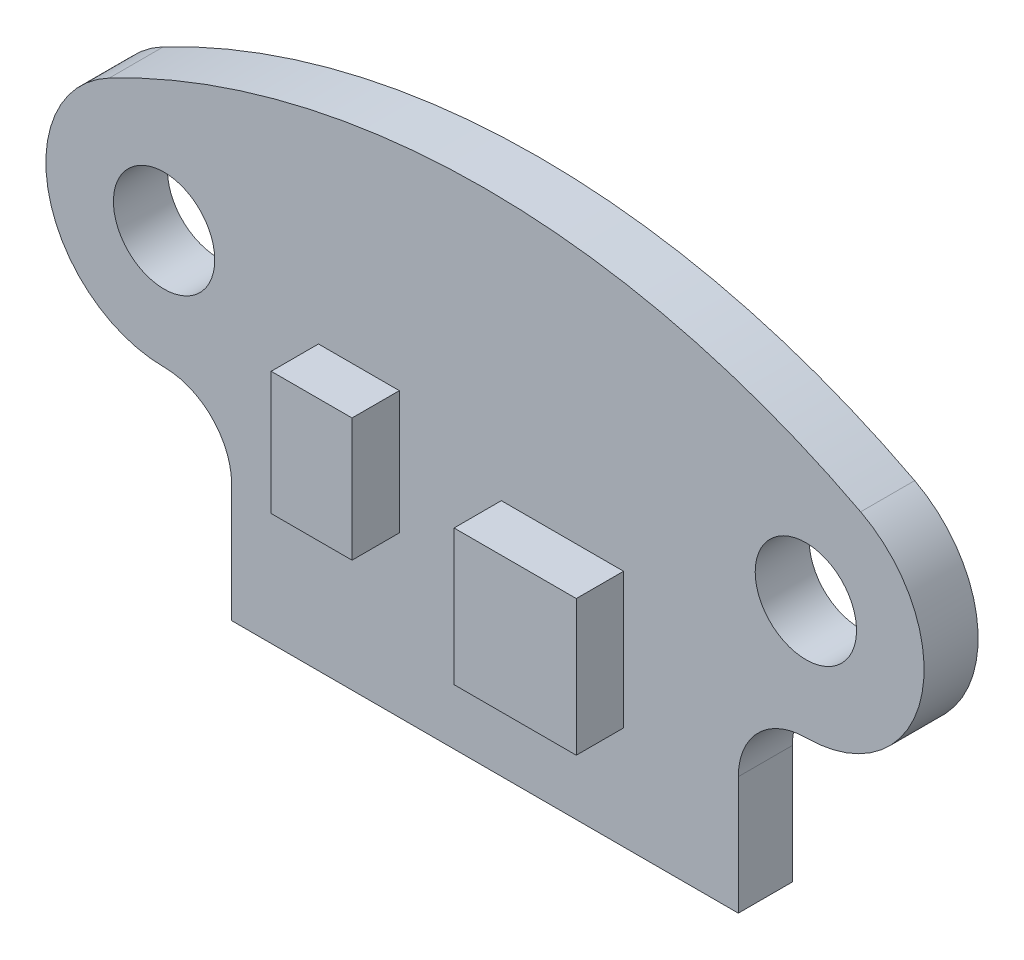
ISO-10303-21;
HEADER;
FILE_DESCRIPTION(('STEP AP214'),'2;1');
FILE_NAME('part.step','',(''),(''),'','','');
FILE_SCHEMA(('AUTOMOTIVE_DESIGN { 1 0 10303 214 1 1 1 1 }'));
ENDSEC;
DATA;
#1=APPLICATION_CONTEXT('core data for automotive mechanical design processes');
#2=APPLICATION_PROTOCOL_DEFINITION('international standard','automotive_design',2000,#1);
#3=PRODUCT_CONTEXT('',#1,'mechanical');
#4=PRODUCT('Part','Part','',(#3));
#5=PRODUCT_RELATED_PRODUCT_CATEGORY('part','',(#4));
#6=PRODUCT_DEFINITION_FORMATION('','',#4);
#7=PRODUCT_DEFINITION_CONTEXT('part definition',#1,'design');
#8=PRODUCT_DEFINITION('design','',#6,#7);
#9=PRODUCT_DEFINITION_SHAPE('','',#8);
#10=(LENGTH_UNIT() NAMED_UNIT(*) SI_UNIT(.MILLI.,.METRE.));
#11=(NAMED_UNIT(*) PLANE_ANGLE_UNIT() SI_UNIT($,.RADIAN.));
#12=(NAMED_UNIT(*) SI_UNIT($,.STERADIAN.) SOLID_ANGLE_UNIT());
#13=UNCERTAINTY_MEASURE_WITH_UNIT(LENGTH_MEASURE(1.E-05),#10,'distance_accuracy_value','');
#14=(GEOMETRIC_REPRESENTATION_CONTEXT(3) GLOBAL_UNCERTAINTY_ASSIGNED_CONTEXT((#13)) GLOBAL_UNIT_ASSIGNED_CONTEXT((#10,
#11,#12)) REPRESENTATION_CONTEXT('',''));
#15=CARTESIAN_POINT('',(0.,0.,0.));
#16=DIRECTION('',(0.,0.,1.));
#17=DIRECTION('',(1.,0.,0.));
#18=AXIS2_PLACEMENT_3D('',#15,#16,#17);
#19=CARTESIAN_POINT('',(17.,9.,-9.89949493661167));
#20=DIRECTION('',(0.,0.,1.));
#21=DIRECTION('',(1.,0.,0.));
#22=AXIS2_PLACEMENT_3D('',#19,#20,#21);
#23=CYLINDRICAL_SURFACE('',#22,3.5);
#24=CARTESIAN_POINT('',(17.,9.,0.));
#25=DIRECTION('',(0.,0.,-1.));
#26=DIRECTION('',(-1.,0.,0.));
#27=AXIS2_PLACEMENT_3D('',#24,#25,#26);
#28=CIRCLE('',#27,3.5);
#29=CARTESIAN_POINT('',(17.,5.5,0.));
#30=VERTEX_POINT('',#29);
#31=CARTESIAN_POINT('',(18.6219512195122,12.1014954846852,0.));
#32=VERTEX_POINT('',#31);
#33=EDGE_CURVE('E243',#30,#32,#28,.F.);
#34=ORIENTED_EDGE('',*,*,#33,.T.);
#35=DIRECTION('',(0.,0.,1.));
#36=VECTOR('',#35,1.);
#37=CARTESIAN_POINT('',(18.6219512195122,12.1014954846852,-22.8439032240007));
#38=LINE('',#37,#36);
#39=CARTESIAN_POINT('',(18.6219512195122,12.1014954846852,1.6));
#40=VERTEX_POINT('',#39);
#41=EDGE_CURVE('E164',#32,#40,#38,.T.);
#42=ORIENTED_EDGE('',*,*,#41,.T.);
#43=CARTESIAN_POINT('',(17.,9.,1.6));
#44=DIRECTION('',(0.,0.,1.));
#45=DIRECTION('',(-1.,0.,0.));
#46=AXIS2_PLACEMENT_3D('',#43,#44,#45);
#47=CIRCLE('',#46,3.5);
#48=CARTESIAN_POINT('',(17.,5.5,1.6));
#49=VERTEX_POINT('',#48);
#50=EDGE_CURVE('E163',#49,#40,#47,.T.);
#51=ORIENTED_EDGE('',*,*,#50,.F.);
#52=DIRECTION('',(0.,0.,1.));
#53=VECTOR('',#52,1.);
#54=CARTESIAN_POINT('',(17.,5.5,-9.89949493661167));
#55=LINE('',#54,#53);
#56=EDGE_CURVE('E206',#49,#30,#55,.F.);
#57=ORIENTED_EDGE('',*,*,#56,.T.);
#58=EDGE_LOOP('',(#34,#42,#51,#57));
#59=FACE_BOUND('',#58,.T.);
#60=ADVANCED_FACE('F37',(#59),#23,.T.);
#61=CARTESIAN_POINT('',(0.,0.,1.6));
#62=DIRECTION('',(0.,0.,-1.));
#63=DIRECTION('',(-1.,0.,0.));
#64=AXIS2_PLACEMENT_3D('',#61,#62,#63);
#65=PLANE('',#64);
#66=CARTESIAN_POINT('',(7.5,-9.16590212458495,1.6));
#67=DIRECTION('',(0.,0.,1.));
#68=DIRECTION('',(-1.,0.,0.));
#69=AXIS2_PLACEMENT_3D('',#66,#67,#68);
#70=CIRCLE('',#69,24.);
#71=CARTESIAN_POINT('',(-3.62195121951219,12.1014954846852,1.6));
#72=VERTEX_POINT('',#71);
#73=EDGE_CURVE('E52',#40,#72,#70,.T.);
#74=ORIENTED_EDGE('',*,*,#73,.T.);
#75=CARTESIAN_POINT('',(-2.,9.,1.6));
#76=DIRECTION('',(0.,0.,1.));
#77=DIRECTION('',(1.,0.,0.));
#78=AXIS2_PLACEMENT_3D('',#75,#76,#77);
#79=CIRCLE('',#78,3.5);
#80=CARTESIAN_POINT('',(-2.,5.5,1.6));
#81=VERTEX_POINT('',#80);
#82=EDGE_CURVE('E160',#72,#81,#79,.T.);
#83=ORIENTED_EDGE('',*,*,#82,.T.);
#84=CARTESIAN_POINT('',(-2.,3.5,1.6));
#85=DIRECTION('',(0.,0.,-1.));
#86=DIRECTION('',(-1.,0.,0.));
#87=AXIS2_PLACEMENT_3D('',#84,#85,#86);
#88=CIRCLE('',#87,2.);
#89=CARTESIAN_POINT('',(0.,3.5,1.6));
#90=VERTEX_POINT('',#89);
#91=EDGE_CURVE('E12',#81,#90,#88,.T.);
#92=ORIENTED_EDGE('',*,*,#91,.T.);
#93=DIRECTION('',(0.,-1.,0.));
#94=VECTOR('',#93,1.);
#95=CARTESIAN_POINT('',(0.,0.,1.6));
#96=LINE('',#95,#94);
#97=CARTESIAN_POINT('',(0.,0.,1.6));
#98=VERTEX_POINT('',#97);
#99=EDGE_CURVE('E184',#90,#98,#96,.T.);
#100=ORIENTED_EDGE('',*,*,#99,.T.);
#101=DIRECTION('',(1.,0.,0.));
#102=VECTOR('',#101,1.);
#103=CARTESIAN_POINT('',(0.,0.,1.6));
#104=LINE('',#103,#102);
#105=CARTESIAN_POINT('',(15.,0.,1.6));
#106=VERTEX_POINT('',#105);
#107=EDGE_CURVE('E186',#98,#106,#104,.T.);
#108=ORIENTED_EDGE('',*,*,#107,.T.);
#109=DIRECTION('',(0.,1.,0.));
#110=VECTOR('',#109,1.);
#111=CARTESIAN_POINT('',(15.,0.,1.6));
#112=LINE('',#111,#110);
#113=CARTESIAN_POINT('',(15.,3.5,1.6));
#114=VERTEX_POINT('',#113);
#115=EDGE_CURVE('E189',#106,#114,#112,.T.);
#116=ORIENTED_EDGE('',*,*,#115,.T.);
#117=CARTESIAN_POINT('',(17.,3.5,1.6));
#118=DIRECTION('',(0.,0.,-1.));
#119=DIRECTION('',(-1.,0.,0.));
#120=AXIS2_PLACEMENT_3D('',#117,#118,#119);
#121=CIRCLE('',#120,2.);
#122=EDGE_CURVE('E212',#114,#49,#121,.T.);
#123=ORIENTED_EDGE('',*,*,#122,.T.);
#124=ORIENTED_EDGE('',*,*,#50,.T.);
#125=EDGE_LOOP('',(#74,#83,#92,#100,#108,#116,#123,#124));
#126=FACE_BOUND('',#125,.T.);
#127=DIRECTION('',(-1.,0.,0.));
#128=VECTOR('',#127,1.);
#129=CARTESIAN_POINT('',(7.98437403809305,7.06847214285232,1.6));
#130=LINE('',#129,#128);
#131=CARTESIAN_POINT('',(11.6029330285529,7.06847214285232,1.6));
#132=VERTEX_POINT('',#131);
#133=CARTESIAN_POINT('',(7.98437403809305,7.06847214285232,1.6));
#134=VERTEX_POINT('',#133);
#135=EDGE_CURVE('E269',#132,#134,#130,.T.);
#136=ORIENTED_EDGE('',*,*,#135,.F.);
#137=DIRECTION('',(0.,1.,0.));
#138=VECTOR('',#137,1.);
#139=CARTESIAN_POINT('',(11.6029330285529,7.06847214285232,1.6));
#140=LINE('',#139,#138);
#141=CARTESIAN_POINT('',(11.6029330285529,3.05101688572764,1.6));
#142=VERTEX_POINT('',#141);
#143=EDGE_CURVE('E272',#142,#132,#140,.T.);
#144=ORIENTED_EDGE('',*,*,#143,.F.);
#145=DIRECTION('',(1.,0.,0.));
#146=VECTOR('',#145,1.);
#147=CARTESIAN_POINT('',(7.98437403809305,3.05101688572764,1.6));
#148=LINE('',#147,#146);
#149=CARTESIAN_POINT('',(7.98437403809305,3.05101688572764,1.6));
#150=VERTEX_POINT('',#149);
#151=EDGE_CURVE('E275',#150,#142,#148,.T.);
#152=ORIENTED_EDGE('',*,*,#151,.F.);
#153=DIRECTION('',(0.,-1.,0.));
#154=VECTOR('',#153,1.);
#155=CARTESIAN_POINT('',(7.98437403809305,7.06847214285232,1.6));
#156=LINE('',#155,#154);
#157=EDGE_CURVE('E278',#134,#150,#156,.T.);
#158=ORIENTED_EDGE('',*,*,#157,.F.);
#159=EDGE_LOOP('',(#136,#144,#152,#158));
#160=FACE_BOUND('',#159,.T.);
#161=CARTESIAN_POINT('',(-2.,9.,1.6));
#162=DIRECTION('',(0.,0.,1.));
#163=DIRECTION('',(1.,0.,0.));
#164=AXIS2_PLACEMENT_3D('',#161,#162,#163);
#165=CIRCLE('',#164,1.5);
#166=CARTESIAN_POINT('',(-0.499999999999999,9.,1.6));
#167=VERTEX_POINT('',#166);
#168=EDGE_CURVE('E171',#167,#167,#165,.T.);
#169=ORIENTED_EDGE('',*,*,#168,.F.);
#170=EDGE_LOOP('',(#169));
#171=FACE_BOUND('',#170,.T.);
#172=CARTESIAN_POINT('',(17.,9.,1.6));
#173=DIRECTION('',(0.,0.,1.));
#174=DIRECTION('',(-1.,0.,0.));
#175=AXIS2_PLACEMENT_3D('',#172,#173,#174);
#176=CIRCLE('',#175,1.5);
#177=CARTESIAN_POINT('',(15.5,9.,1.6));
#178=VERTEX_POINT('',#177);
#179=EDGE_CURVE('E244',#178,#178,#176,.T.);
#180=ORIENTED_EDGE('',*,*,#179,.F.);
#181=EDGE_LOOP('',(#180));
#182=FACE_BOUND('',#181,.T.);
#183=DIRECTION('',(-1.,0.,0.));
#184=VECTOR('',#183,1.);
#185=CARTESIAN_POINT('',(2.57078184764135,8.37913130475115,1.6));
#186=LINE('',#185,#184);
#187=CARTESIAN_POINT('',(4.96415944763052,8.37913130475115,1.6));
#188=VERTEX_POINT('',#187);
#189=CARTESIAN_POINT('',(2.57078184764135,8.37913130475115,1.6));
#190=VERTEX_POINT('',#189);
#191=EDGE_CURVE('E60',#188,#190,#186,.T.);
#192=ORIENTED_EDGE('',*,*,#191,.F.);
#193=DIRECTION('',(0.,1.,0.));
#194=VECTOR('',#193,1.);
#195=CARTESIAN_POINT('',(4.96415944763052,8.37913130475115,1.6));
#196=LINE('',#195,#194);
#197=CARTESIAN_POINT('',(4.96415944763052,4.73207972381527,1.6));
#198=VERTEX_POINT('',#197);
#199=EDGE_CURVE('E302',#198,#188,#196,.T.);
#200=ORIENTED_EDGE('',*,*,#199,.F.);
#201=DIRECTION('',(1.,0.,0.));
#202=VECTOR('',#201,1.);
#203=CARTESIAN_POINT('',(2.57078184764135,4.73207972381527,1.6));
#204=LINE('',#203,#202);
#205=CARTESIAN_POINT('',(2.57078184764135,4.73207972381527,1.6));
#206=VERTEX_POINT('',#205);
#207=EDGE_CURVE('E305',#206,#198,#204,.T.);
#208=ORIENTED_EDGE('',*,*,#207,.F.);
#209=DIRECTION('',(0.,-1.,0.));
#210=VECTOR('',#209,1.);
#211=CARTESIAN_POINT('',(2.57078184764135,8.37913130475115,1.6));
#212=LINE('',#211,#210);
#213=EDGE_CURVE('E154',#190,#206,#212,.T.);
#214=ORIENTED_EDGE('',*,*,#213,.F.);
#215=EDGE_LOOP('',(#192,#200,#208,#214));
#216=FACE_BOUND('',#215,.T.);
#217=ADVANCED_FACE('F158',(#126,#160,#171,#182,#216),#65,.F.);
#218=CARTESIAN_POINT('',(15.,0.,1.6));
#219=DIRECTION('',(-1.,0.,0.));
#220=DIRECTION('',(0.,0.,1.));
#221=AXIS2_PLACEMENT_3D('',#218,#219,#220);
#222=PLANE('',#221);
#223=DIRECTION('',(0.,1.,0.));
#224=VECTOR('',#223,1.);
#225=CARTESIAN_POINT('',(15.,0.,0.));
#226=LINE('',#225,#224);
#227=CARTESIAN_POINT('',(15.,0.,0.));
#228=VERTEX_POINT('',#227);
#229=CARTESIAN_POINT('',(15.,3.5,0.));
#230=VERTEX_POINT('',#229);
#231=EDGE_CURVE('E187',#228,#230,#226,.T.);
#232=ORIENTED_EDGE('',*,*,#231,.T.);
#233=DIRECTION('',(0.,0.,1.));
#234=VECTOR('',#233,1.);
#235=CARTESIAN_POINT('',(15.,3.5,1.6));
#236=LINE('',#235,#234);
#237=EDGE_CURVE('E203',#230,#114,#236,.T.);
#238=ORIENTED_EDGE('',*,*,#237,.T.);
#239=ORIENTED_EDGE('',*,*,#115,.F.);
#240=DIRECTION('',(0.,0.,-1.));
#241=VECTOR('',#240,1.);
#242=CARTESIAN_POINT('',(15.,0.,1.6));
#243=LINE('',#242,#241);
#244=EDGE_CURVE('E192',#106,#228,#243,.T.);
#245=ORIENTED_EDGE('',*,*,#244,.T.);
#246=EDGE_LOOP('',(#232,#238,#239,#245));
#247=FACE_BOUND('',#246,.T.);
#248=ADVANCED_FACE('F233',(#247),#222,.F.);
#249=CARTESIAN_POINT('',(0.,0.,1.6));
#250=DIRECTION('',(1.,0.,0.));
#251=DIRECTION('',(0.,0.,-1.));
#252=AXIS2_PLACEMENT_3D('',#249,#250,#251);
#253=PLANE('',#252);
#254=ORIENTED_EDGE('',*,*,#99,.F.);
#255=DIRECTION('',(0.,0.,1.));
#256=VECTOR('',#255,1.);
#257=CARTESIAN_POINT('',(0.,3.5,1.6));
#258=LINE('',#257,#256);
#259=CARTESIAN_POINT('',(0.,3.5,0.));
#260=VERTEX_POINT('',#259);
#261=EDGE_CURVE('E208',#90,#260,#258,.F.);
#262=ORIENTED_EDGE('',*,*,#261,.T.);
#263=DIRECTION('',(0.,-1.,0.));
#264=VECTOR('',#263,1.);
#265=CARTESIAN_POINT('',(0.,0.,0.));
#266=LINE('',#265,#264);
#267=CARTESIAN_POINT('',(0.,0.,0.));
#268=VERTEX_POINT('',#267);
#269=EDGE_CURVE('E174',#260,#268,#266,.T.);
#270=ORIENTED_EDGE('',*,*,#269,.T.);
#271=DIRECTION('',(0.,0.,-1.));
#272=VECTOR('',#271,1.);
#273=CARTESIAN_POINT('',(0.,0.,1.6));
#274=LINE('',#273,#272);
#275=EDGE_CURVE('E200',#98,#268,#274,.T.);
#276=ORIENTED_EDGE('',*,*,#275,.F.);
#277=EDGE_LOOP('',(#254,#262,#270,#276));
#278=FACE_BOUND('',#277,.T.);
#279=ADVANCED_FACE('F227',(#278),#253,.F.);
#280=CARTESIAN_POINT('',(0.,0.,1.6));
#281=DIRECTION('',(0.,1.,0.));
#282=DIRECTION('',(0.,0.,1.));
#283=AXIS2_PLACEMENT_3D('',#280,#281,#282);
#284=PLANE('',#283);
#285=DIRECTION('',(1.,0.,0.));
#286=VECTOR('',#285,1.);
#287=CARTESIAN_POINT('',(0.,0.,0.));
#288=LINE('',#287,#286);
#289=EDGE_CURVE('E194',#268,#228,#288,.T.);
#290=ORIENTED_EDGE('',*,*,#289,.T.);
#291=ORIENTED_EDGE('',*,*,#244,.F.);
#292=ORIENTED_EDGE('',*,*,#107,.F.);
#293=ORIENTED_EDGE('',*,*,#275,.T.);
#294=EDGE_LOOP('',(#290,#291,#292,#293));
#295=FACE_BOUND('',#294,.T.);
#296=ADVANCED_FACE('F229',(#295),#284,.F.);
#297=CARTESIAN_POINT('',(0.,0.,0.));
#298=DIRECTION('',(0.,0.,-1.));
#299=DIRECTION('',(-1.,0.,0.));
#300=AXIS2_PLACEMENT_3D('',#297,#298,#299);
#301=PLANE('',#300);
#302=CARTESIAN_POINT('',(-2.,9.,0.));
#303=DIRECTION('',(0.,0.,-1.));
#304=DIRECTION('',(-1.,0.,0.));
#305=AXIS2_PLACEMENT_3D('',#302,#303,#304);
#306=CIRCLE('',#305,3.5);
#307=CARTESIAN_POINT('',(-3.62195121951219,12.1014954846852,0.));
#308=VERTEX_POINT('',#307);
#309=CARTESIAN_POINT('',(-2.,5.5,0.));
#310=VERTEX_POINT('',#309);
#311=EDGE_CURVE('E177',#308,#310,#306,.F.);
#312=ORIENTED_EDGE('',*,*,#311,.F.);
#313=CARTESIAN_POINT('',(7.5,-9.16590212458495,0.));
#314=DIRECTION('',(0.,0.,-1.));
#315=DIRECTION('',(-1.,0.,0.));
#316=AXIS2_PLACEMENT_3D('',#313,#314,#315);
#317=CIRCLE('',#316,24.);
#318=EDGE_CURVE('E150',#32,#308,#317,.F.);
#319=ORIENTED_EDGE('',*,*,#318,.F.);
#320=ORIENTED_EDGE('',*,*,#33,.F.);
#321=CARTESIAN_POINT('',(17.,3.5,0.));
#322=DIRECTION('',(0.,0.,-1.));
#323=DIRECTION('',(-1.,0.,0.));
#324=AXIS2_PLACEMENT_3D('',#321,#322,#323);
#325=CIRCLE('',#324,2.);
#326=EDGE_CURVE('E214',#30,#230,#325,.F.);
#327=ORIENTED_EDGE('',*,*,#326,.T.);
#328=ORIENTED_EDGE('',*,*,#231,.F.);
#329=ORIENTED_EDGE('',*,*,#289,.F.);
#330=ORIENTED_EDGE('',*,*,#269,.F.);
#331=CARTESIAN_POINT('',(-2.,3.5,0.));
#332=DIRECTION('',(0.,0.,-1.));
#333=DIRECTION('',(-1.,0.,0.));
#334=AXIS2_PLACEMENT_3D('',#331,#332,#333);
#335=CIRCLE('',#334,2.);
#336=EDGE_CURVE('E45',#260,#310,#335,.F.);
#337=ORIENTED_EDGE('',*,*,#336,.T.);
#338=EDGE_LOOP('',(#312,#319,#320,#327,#328,#329,#330,#337));
#339=FACE_BOUND('',#338,.T.);
#340=CARTESIAN_POINT('',(-2.,9.,0.));
#341=DIRECTION('',(0.,0.,-1.));
#342=DIRECTION('',(-1.,0.,0.));
#343=AXIS2_PLACEMENT_3D('',#340,#341,#342);
#344=CIRCLE('',#343,1.5);
#345=CARTESIAN_POINT('',(-3.5,9.,0.));
#346=VERTEX_POINT('',#345);
#347=EDGE_CURVE('E170',#346,#346,#344,.F.);
#348=ORIENTED_EDGE('',*,*,#347,.T.);
#349=EDGE_LOOP('',(#348));
#350=FACE_BOUND('',#349,.T.);
#351=CARTESIAN_POINT('',(17.,9.,0.));
#352=DIRECTION('',(0.,0.,-1.));
#353=DIRECTION('',(-1.,0.,0.));
#354=AXIS2_PLACEMENT_3D('',#351,#352,#353);
#355=CIRCLE('',#354,1.5);
#356=CARTESIAN_POINT('',(15.5,9.,0.));
#357=VERTEX_POINT('',#356);
#358=EDGE_CURVE('E180',#357,#357,#355,.F.);
#359=ORIENTED_EDGE('',*,*,#358,.T.);
#360=EDGE_LOOP('',(#359));
#361=FACE_BOUND('',#360,.T.);
#362=ADVANCED_FACE('F218',(#339,#350,#361),#301,.T.);
#363=CARTESIAN_POINT('',(-2.,9.,-9.89949493661167));
#364=DIRECTION('',(0.,0.,1.));
#365=DIRECTION('',(1.,0.,0.));
#366=AXIS2_PLACEMENT_3D('',#363,#364,#365);
#367=CYLINDRICAL_SURFACE('',#366,3.5);
#368=DIRECTION('',(0.,0.,1.));
#369=VECTOR('',#368,1.);
#370=CARTESIAN_POINT('',(-3.62195121951219,12.1014954846852,-22.8439032240007));
#371=LINE('',#370,#369);
#372=EDGE_CURVE('E148',#308,#72,#371,.T.);
#373=ORIENTED_EDGE('',*,*,#372,.F.);
#374=ORIENTED_EDGE('',*,*,#311,.T.);
#375=DIRECTION('',(0.,0.,1.));
#376=VECTOR('',#375,1.);
#377=CARTESIAN_POINT('',(-2.,5.5,-9.89949493661167));
#378=LINE('',#377,#376);
#379=EDGE_CURVE('E168',#310,#81,#378,.T.);
#380=ORIENTED_EDGE('',*,*,#379,.T.);
#381=ORIENTED_EDGE('',*,*,#82,.F.);
#382=EDGE_LOOP('',(#373,#374,#380,#381));
#383=FACE_BOUND('',#382,.T.);
#384=ADVANCED_FACE('F166',(#383),#367,.T.);
#385=CARTESIAN_POINT('',(-2.,9.,-9.89949493661167));
#386=DIRECTION('',(0.,0.,1.));
#387=DIRECTION('',(1.,0.,0.));
#388=AXIS2_PLACEMENT_3D('',#385,#386,#387);
#389=CYLINDRICAL_SURFACE('',#388,1.5);
#390=ORIENTED_EDGE('',*,*,#168,.T.);
#391=EDGE_LOOP('',(#390));
#392=FACE_BOUND('',#391,.T.);
#393=ORIENTED_EDGE('',*,*,#347,.F.);
#394=EDGE_LOOP('',(#393));
#395=FACE_BOUND('',#394,.T.);
#396=ADVANCED_FACE('F356',(#392,#395),#389,.F.);
#397=CARTESIAN_POINT('',(17.,9.,-9.89949493661167));
#398=DIRECTION('',(0.,0.,1.));
#399=DIRECTION('',(1.,0.,0.));
#400=AXIS2_PLACEMENT_3D('',#397,#398,#399);
#401=CYLINDRICAL_SURFACE('',#400,1.5);
#402=ORIENTED_EDGE('',*,*,#179,.T.);
#403=EDGE_LOOP('',(#402));
#404=FACE_BOUND('',#403,.T.);
#405=ORIENTED_EDGE('',*,*,#358,.F.);
#406=EDGE_LOOP('',(#405));
#407=FACE_BOUND('',#406,.T.);
#408=ADVANCED_FACE('F353',(#404,#407),#401,.F.);
#409=CARTESIAN_POINT('',(17.,3.5,-9.89949493661167));
#410=DIRECTION('',(0.,0.,1.));
#411=DIRECTION('',(1.,0.,0.));
#412=AXIS2_PLACEMENT_3D('',#409,#410,#411);
#413=CYLINDRICAL_SURFACE('',#412,2.);
#414=ORIENTED_EDGE('',*,*,#326,.F.);
#415=ORIENTED_EDGE('',*,*,#56,.F.);
#416=ORIENTED_EDGE('',*,*,#122,.F.);
#417=ORIENTED_EDGE('',*,*,#237,.F.);
#418=EDGE_LOOP('',(#414,#415,#416,#417));
#419=FACE_BOUND('',#418,.T.);
#420=ADVANCED_FACE('F238',(#419),#413,.F.);
#421=CARTESIAN_POINT('',(-2.,3.5,-9.89949493661167));
#422=DIRECTION('',(0.,0.,1.));
#423=DIRECTION('',(1.,0.,0.));
#424=AXIS2_PLACEMENT_3D('',#421,#422,#423);
#425=CYLINDRICAL_SURFACE('',#424,2.);
#426=ORIENTED_EDGE('',*,*,#91,.F.);
#427=ORIENTED_EDGE('',*,*,#379,.F.);
#428=ORIENTED_EDGE('',*,*,#336,.F.);
#429=ORIENTED_EDGE('',*,*,#261,.F.);
#430=EDGE_LOOP('',(#426,#427,#428,#429));
#431=FACE_BOUND('',#430,.T.);
#432=ADVANCED_FACE('F39',(#431),#425,.F.);
#433=CARTESIAN_POINT('',(7.98437403809305,7.06847214285232,11.4068397341179));
#434=DIRECTION('',(0.,-1.,0.));
#435=DIRECTION('',(0.,0.,-1.));
#436=AXIS2_PLACEMENT_3D('',#433,#434,#435);
#437=PLANE('',#436);
#438=DIRECTION('',(0.,0.,-1.));
#439=VECTOR('',#438,1.);
#440=CARTESIAN_POINT('',(7.98437403809305,7.06847214285232,11.4068397341179));
#441=LINE('',#440,#439);
#442=CARTESIAN_POINT('',(7.98437403809305,7.06847214285232,3.));
#443=VERTEX_POINT('',#442);
#444=EDGE_CURVE('E266',#443,#134,#441,.T.);
#445=ORIENTED_EDGE('',*,*,#444,.F.);
#446=DIRECTION('',(1.,0.,0.));
#447=VECTOR('',#446,1.);
#448=CARTESIAN_POINT('',(7.98437403809305,7.06847214285232,3.));
#449=LINE('',#448,#447);
#450=CARTESIAN_POINT('',(11.6029330285529,7.06847214285232,3.));
#451=VERTEX_POINT('',#450);
#452=EDGE_CURVE('E253',#443,#451,#449,.T.);
#453=ORIENTED_EDGE('',*,*,#452,.T.);
#454=DIRECTION('',(0.,0.,-1.));
#455=VECTOR('',#454,1.);
#456=CARTESIAN_POINT('',(11.6029330285529,7.06847214285232,11.4068397341179));
#457=LINE('',#456,#455);
#458=EDGE_CURVE('E263',#451,#132,#457,.T.);
#459=ORIENTED_EDGE('',*,*,#458,.T.);
#460=ORIENTED_EDGE('',*,*,#135,.T.);
#461=EDGE_LOOP('',(#445,#453,#459,#460));
#462=FACE_BOUND('',#461,.T.);
#463=ADVANCED_FACE('F374',(#462),#437,.F.);
#464=CARTESIAN_POINT('',(11.6029330285529,7.06847214285232,11.4068397341179));
#465=DIRECTION('',(-1.,0.,0.));
#466=DIRECTION('',(0.,0.,1.));
#467=AXIS2_PLACEMENT_3D('',#464,#465,#466);
#468=PLANE('',#467);
#469=ORIENTED_EDGE('',*,*,#458,.F.);
#470=DIRECTION('',(0.,-1.,0.));
#471=VECTOR('',#470,1.);
#472=CARTESIAN_POINT('',(11.6029330285529,7.06847214285232,3.));
#473=LINE('',#472,#471);
#474=CARTESIAN_POINT('',(11.6029330285529,3.05101688572764,3.));
#475=VERTEX_POINT('',#474);
#476=EDGE_CURVE('E256',#451,#475,#473,.T.);
#477=ORIENTED_EDGE('',*,*,#476,.T.);
#478=DIRECTION('',(0.,0.,-1.));
#479=VECTOR('',#478,1.);
#480=CARTESIAN_POINT('',(11.6029330285529,3.05101688572764,11.4068397341179));
#481=LINE('',#480,#479);
#482=EDGE_CURVE('E260',#475,#142,#481,.T.);
#483=ORIENTED_EDGE('',*,*,#482,.T.);
#484=ORIENTED_EDGE('',*,*,#143,.T.);
#485=EDGE_LOOP('',(#469,#477,#483,#484));
#486=FACE_BOUND('',#485,.T.);
#487=ADVANCED_FACE('F378',(#486),#468,.F.);
#488=CARTESIAN_POINT('',(7.98437403809305,3.05101688572764,11.4068397341179));
#489=DIRECTION('',(0.,1.,0.));
#490=DIRECTION('',(0.,0.,1.));
#491=AXIS2_PLACEMENT_3D('',#488,#489,#490);
#492=PLANE('',#491);
#493=ORIENTED_EDGE('',*,*,#482,.F.);
#494=DIRECTION('',(-1.,0.,0.));
#495=VECTOR('',#494,1.);
#496=CARTESIAN_POINT('',(7.98437403809305,3.05101688572764,3.));
#497=LINE('',#496,#495);
#498=CARTESIAN_POINT('',(7.98437403809305,3.05101688572764,3.));
#499=VERTEX_POINT('',#498);
#500=EDGE_CURVE('E249',#475,#499,#497,.T.);
#501=ORIENTED_EDGE('',*,*,#500,.T.);
#502=DIRECTION('',(0.,0.,-1.));
#503=VECTOR('',#502,1.);
#504=CARTESIAN_POINT('',(7.98437403809305,3.05101688572764,11.4068397341179));
#505=LINE('',#504,#503);
#506=EDGE_CURVE('E257',#499,#150,#505,.T.);
#507=ORIENTED_EDGE('',*,*,#506,.T.);
#508=ORIENTED_EDGE('',*,*,#151,.T.);
#509=EDGE_LOOP('',(#493,#501,#507,#508));
#510=FACE_BOUND('',#509,.T.);
#511=ADVANCED_FACE('F384',(#510),#492,.F.);
#512=CARTESIAN_POINT('',(7.98437403809305,7.06847214285232,11.4068397341179));
#513=DIRECTION('',(1.,0.,0.));
#514=DIRECTION('',(0.,0.,-1.));
#515=AXIS2_PLACEMENT_3D('',#512,#513,#514);
#516=PLANE('',#515);
#517=ORIENTED_EDGE('',*,*,#506,.F.);
#518=DIRECTION('',(0.,1.,0.));
#519=VECTOR('',#518,1.);
#520=CARTESIAN_POINT('',(7.98437403809305,7.06847214285232,3.));
#521=LINE('',#520,#519);
#522=EDGE_CURVE('E245',#499,#443,#521,.T.);
#523=ORIENTED_EDGE('',*,*,#522,.T.);
#524=ORIENTED_EDGE('',*,*,#444,.T.);
#525=ORIENTED_EDGE('',*,*,#157,.T.);
#526=EDGE_LOOP('',(#517,#523,#524,#525));
#527=FACE_BOUND('',#526,.T.);
#528=ADVANCED_FACE('F340',(#527),#516,.F.);
#529=CARTESIAN_POINT('',(0.,0.,3.));
#530=DIRECTION('',(0.,0.,-1.));
#531=DIRECTION('',(-1.,0.,0.));
#532=AXIS2_PLACEMENT_3D('',#529,#530,#531);
#533=PLANE('',#532);
#534=ORIENTED_EDGE('',*,*,#500,.F.);
#535=ORIENTED_EDGE('',*,*,#476,.F.);
#536=ORIENTED_EDGE('',*,*,#452,.F.);
#537=ORIENTED_EDGE('',*,*,#522,.F.);
#538=EDGE_LOOP('',(#534,#535,#536,#537));
#539=FACE_BOUND('',#538,.T.);
#540=ADVANCED_FACE('F333',(#539),#533,.F.);
#541=CARTESIAN_POINT('',(2.57078184764135,8.37913130475115,11.4068397341179));
#542=DIRECTION('',(0.,-1.,0.));
#543=DIRECTION('',(0.,0.,-1.));
#544=AXIS2_PLACEMENT_3D('',#541,#542,#543);
#545=PLANE('',#544);
#546=DIRECTION('',(0.,0.,-1.));
#547=VECTOR('',#546,1.);
#548=CARTESIAN_POINT('',(2.57078184764135,8.37913130475115,11.4068397341179));
#549=LINE('',#548,#547);
#550=CARTESIAN_POINT('',(2.57078184764135,8.37913130475115,3.));
#551=VERTEX_POINT('',#550);
#552=EDGE_CURVE('E298',#551,#190,#549,.T.);
#553=ORIENTED_EDGE('',*,*,#552,.F.);
#554=DIRECTION('',(1.,0.,0.));
#555=VECTOR('',#554,1.);
#556=CARTESIAN_POINT('',(2.57078184764135,8.37913130475115,3.));
#557=LINE('',#556,#555);
#558=CARTESIAN_POINT('',(4.96415944763052,8.37913130475115,3.));
#559=VERTEX_POINT('',#558);
#560=EDGE_CURVE('E286',#551,#559,#557,.T.);
#561=ORIENTED_EDGE('',*,*,#560,.T.);
#562=DIRECTION('',(0.,0.,-1.));
#563=VECTOR('',#562,1.);
#564=CARTESIAN_POINT('',(4.96415944763052,8.37913130475115,11.4068397341179));
#565=LINE('',#564,#563);
#566=EDGE_CURVE('E296',#559,#188,#565,.T.);
#567=ORIENTED_EDGE('',*,*,#566,.T.);
#568=ORIENTED_EDGE('',*,*,#191,.T.);
#569=EDGE_LOOP('',(#553,#561,#567,#568));
#570=FACE_BOUND('',#569,.T.);
#571=ADVANCED_FACE('F331',(#570),#545,.F.);
#572=CARTESIAN_POINT('',(4.96415944763052,8.37913130475115,11.4068397341179));
#573=DIRECTION('',(-1.,0.,0.));
#574=DIRECTION('',(0.,0.,1.));
#575=AXIS2_PLACEMENT_3D('',#572,#573,#574);
#576=PLANE('',#575);
#577=ORIENTED_EDGE('',*,*,#566,.F.);
#578=DIRECTION('',(0.,-1.,0.));
#579=VECTOR('',#578,1.);
#580=CARTESIAN_POINT('',(4.96415944763052,8.37913130475115,3.));
#581=LINE('',#580,#579);
#582=CARTESIAN_POINT('',(4.96415944763052,4.73207972381527,3.));
#583=VERTEX_POINT('',#582);
#584=EDGE_CURVE('E289',#559,#583,#581,.T.);
#585=ORIENTED_EDGE('',*,*,#584,.T.);
#586=DIRECTION('',(0.,0.,-1.));
#587=VECTOR('',#586,1.);
#588=CARTESIAN_POINT('',(4.96415944763052,4.73207972381527,11.4068397341179));
#589=LINE('',#588,#587);
#590=EDGE_CURVE('E293',#583,#198,#589,.T.);
#591=ORIENTED_EDGE('',*,*,#590,.T.);
#592=ORIENTED_EDGE('',*,*,#199,.T.);
#593=EDGE_LOOP('',(#577,#585,#591,#592));
#594=FACE_BOUND('',#593,.T.);
#595=ADVANCED_FACE('F320',(#594),#576,.F.);
#596=CARTESIAN_POINT('',(2.57078184764135,4.73207972381527,11.4068397341179));
#597=DIRECTION('',(0.,1.,0.));
#598=DIRECTION('',(0.,0.,1.));
#599=AXIS2_PLACEMENT_3D('',#596,#597,#598);
#600=PLANE('',#599);
#601=ORIENTED_EDGE('',*,*,#590,.F.);
#602=DIRECTION('',(-1.,0.,0.));
#603=VECTOR('',#602,1.);
#604=CARTESIAN_POINT('',(2.57078184764135,4.73207972381527,3.));
#605=LINE('',#604,#603);
#606=CARTESIAN_POINT('',(2.57078184764135,4.73207972381527,3.));
#607=VERTEX_POINT('',#606);
#608=EDGE_CURVE('E312',#583,#607,#605,.T.);
#609=ORIENTED_EDGE('',*,*,#608,.T.);
#610=DIRECTION('',(0.,0.,-1.));
#611=VECTOR('',#610,1.);
#612=CARTESIAN_POINT('',(2.57078184764135,4.73207972381527,11.4068397341179));
#613=LINE('',#612,#611);
#614=EDGE_CURVE('E290',#607,#206,#613,.T.);
#615=ORIENTED_EDGE('',*,*,#614,.T.);
#616=ORIENTED_EDGE('',*,*,#207,.T.);
#617=EDGE_LOOP('',(#601,#609,#615,#616));
#618=FACE_BOUND('',#617,.T.);
#619=ADVANCED_FACE('F326',(#618),#600,.F.);
#620=CARTESIAN_POINT('',(2.57078184764135,8.37913130475115,11.4068397341179));
#621=DIRECTION('',(1.,0.,0.));
#622=DIRECTION('',(0.,0.,-1.));
#623=AXIS2_PLACEMENT_3D('',#620,#621,#622);
#624=PLANE('',#623);
#625=ORIENTED_EDGE('',*,*,#614,.F.);
#626=DIRECTION('',(0.,1.,0.));
#627=VECTOR('',#626,1.);
#628=CARTESIAN_POINT('',(2.57078184764135,8.37913130475115,3.));
#629=LINE('',#628,#627);
#630=EDGE_CURVE('E280',#607,#551,#629,.T.);
#631=ORIENTED_EDGE('',*,*,#630,.T.);
#632=ORIENTED_EDGE('',*,*,#552,.T.);
#633=ORIENTED_EDGE('',*,*,#213,.T.);
#634=EDGE_LOOP('',(#625,#631,#632,#633));
#635=FACE_BOUND('',#634,.T.);
#636=ADVANCED_FACE('F329',(#635),#624,.F.);
#637=CARTESIAN_POINT('',(0.,0.,3.));
#638=DIRECTION('',(0.,0.,-1.));
#639=DIRECTION('',(-1.,0.,0.));
#640=AXIS2_PLACEMENT_3D('',#637,#638,#639);
#641=PLANE('',#640);
#642=ORIENTED_EDGE('',*,*,#608,.F.);
#643=ORIENTED_EDGE('',*,*,#584,.F.);
#644=ORIENTED_EDGE('',*,*,#560,.F.);
#645=ORIENTED_EDGE('',*,*,#630,.F.);
#646=EDGE_LOOP('',(#642,#643,#644,#645));
#647=FACE_BOUND('',#646,.T.);
#648=ADVANCED_FACE('F323',(#647),#641,.F.);
#649=CARTESIAN_POINT('',(7.5,-9.16590212458495,-22.8439032240007));
#650=DIRECTION('',(0.,0.,1.));
#651=DIRECTION('',(1.,0.,0.));
#652=AXIS2_PLACEMENT_3D('',#649,#650,#651);
#653=CYLINDRICAL_SURFACE('',#652,24.);
#654=ORIENTED_EDGE('',*,*,#41,.F.);
#655=ORIENTED_EDGE('',*,*,#318,.T.);
#656=ORIENTED_EDGE('',*,*,#372,.T.);
#657=ORIENTED_EDGE('',*,*,#73,.F.);
#658=EDGE_LOOP('',(#654,#655,#656,#657));
#659=FACE_BOUND('',#658,.T.);
#660=ADVANCED_FACE('F149',(#659),#653,.T.);
#661=CLOSED_SHELL('',(#60,#217,#248,#279,#296,#362,#384,#396,#408,#420,#432,#463,#487,#511,#528,
#540,#571,#595,#619,#636,#648,#660));
#662=MANIFOLD_SOLID_BREP('B2',#661);
#663=ADVANCED_BREP_SHAPE_REPRESENTATION('',(#18,#662),#14);
#664=SHAPE_DEFINITION_REPRESENTATION(#9,#663);
ENDSEC;
END-ISO-10303-21;
